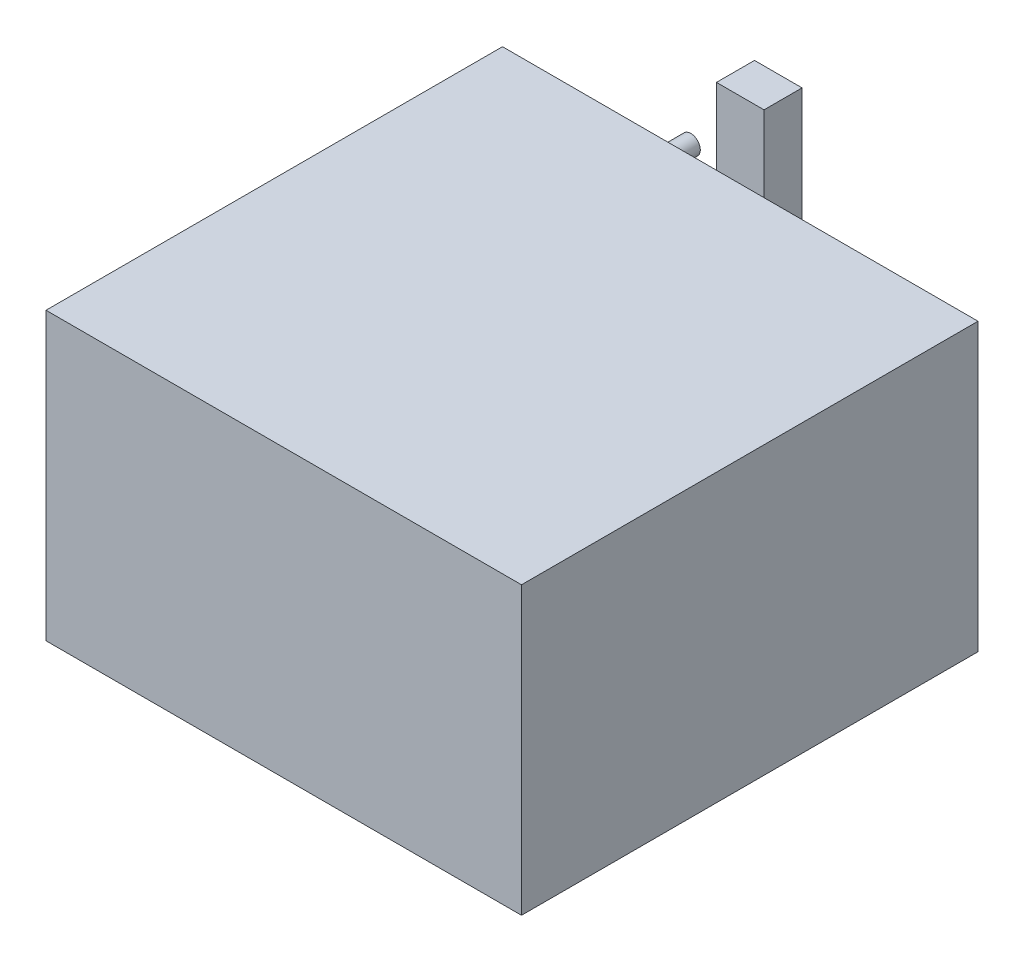
ISO-10303-21;
HEADER;
FILE_DESCRIPTION(('STEP AP214'),'2;1');
FILE_NAME('part.step','',(''),(''),'','','');
FILE_SCHEMA(('AUTOMOTIVE_DESIGN { 1 0 10303 214 1 1 1 1 }'));
ENDSEC;
DATA;
#1=APPLICATION_CONTEXT('core data for automotive mechanical design processes');
#2=APPLICATION_PROTOCOL_DEFINITION('international standard','automotive_design',2000,#1);
#3=PRODUCT_CONTEXT('',#1,'mechanical');
#4=PRODUCT('Part','Part','',(#3));
#5=PRODUCT_RELATED_PRODUCT_CATEGORY('part','',(#4));
#6=PRODUCT_DEFINITION_FORMATION('','',#4);
#7=PRODUCT_DEFINITION_CONTEXT('part definition',#1,'design');
#8=PRODUCT_DEFINITION('design','',#6,#7);
#9=PRODUCT_DEFINITION_SHAPE('','',#8);
#10=(LENGTH_UNIT() NAMED_UNIT(*) SI_UNIT(.MILLI.,.METRE.));
#11=(NAMED_UNIT(*) PLANE_ANGLE_UNIT() SI_UNIT($,.RADIAN.));
#12=(NAMED_UNIT(*) SI_UNIT($,.STERADIAN.) SOLID_ANGLE_UNIT());
#13=UNCERTAINTY_MEASURE_WITH_UNIT(LENGTH_MEASURE(1.E-05),#10,'distance_accuracy_value','');
#14=(GEOMETRIC_REPRESENTATION_CONTEXT(3) GLOBAL_UNCERTAINTY_ASSIGNED_CONTEXT((#13)) GLOBAL_UNIT_ASSIGNED_CONTEXT((#10,
#11,#12)) REPRESENTATION_CONTEXT('',''));
#15=CARTESIAN_POINT('',(0.,0.,0.));
#16=DIRECTION('',(0.,0.,1.));
#17=DIRECTION('',(1.,0.,0.));
#18=AXIS2_PLACEMENT_3D('',#15,#16,#17);
#19=CARTESIAN_POINT('',(-29.5791256800389,10.0182330252573,0.));
#20=DIRECTION('',(0.,0.,1.));
#21=DIRECTION('',(1.,0.,0.));
#22=AXIS2_PLACEMENT_3D('',#19,#20,#21);
#23=PLANE('',#22);
#24=CARTESIAN_POINT('',(-24.6791256800389,20.5682308652573,0.));
#25=DIRECTION('',(0.,0.,1.));
#26=DIRECTION('',(1.,0.,0.));
#27=AXIS2_PLACEMENT_3D('',#24,#25,#26);
#28=CIRCLE('',#27,0.499999999999999);
#29=CARTESIAN_POINT('',(-24.1791256800389,20.5682308652573,0.));
#30=VERTEX_POINT('',#29);
#31=EDGE_CURVE('E41',#30,#30,#28,.F.);
#32=ORIENTED_EDGE('',*,*,#31,.F.);
#33=EDGE_LOOP('',(#32));
#34=FACE_BOUND('',#33,.T.);
#35=CARTESIAN_POINT('',(-24.6791256800389,14.5682308652573,0.));
#36=DIRECTION('',(0.,0.,1.));
#37=DIRECTION('',(1.,0.,0.));
#38=AXIS2_PLACEMENT_3D('',#35,#36,#37);
#39=CIRCLE('',#38,0.499999999999999);
#40=CARTESIAN_POINT('',(-24.1791256800389,14.5682308652573,0.));
#41=VERTEX_POINT('',#40);
#42=EDGE_CURVE('E11',#41,#41,#39,.F.);
#43=ORIENTED_EDGE('',*,*,#42,.F.);
#44=EDGE_LOOP('',(#43));
#45=FACE_BOUND('',#44,.T.);
#46=DIRECTION('',(0.,-1.,0.));
#47=VECTOR('',#46,1.);
#48=CARTESIAN_POINT('',(-15.8291248800389,13.0182330252573,0.));
#49=LINE('',#48,#47);
#50=CARTESIAN_POINT('',(-15.8291248800389,13.0182330252573,0.));
#51=VERTEX_POINT('',#50);
#52=CARTESIAN_POINT('',(-15.8291248800389,10.0182330252573,0.));
#53=VERTEX_POINT('',#52);
#54=EDGE_CURVE('E48',#51,#53,#49,.T.);
#55=ORIENTED_EDGE('',*,*,#54,.F.);
#56=DIRECTION('',(1.,0.,0.));
#57=VECTOR('',#56,1.);
#58=CARTESIAN_POINT('',(-15.8291248800389,13.0182330252573,0.));
#59=LINE('',#58,#57);
#60=CARTESIAN_POINT('',(-18.3291248800389,13.0182330252573,0.));
#61=VERTEX_POINT('',#60);
#62=EDGE_CURVE('E153',#61,#51,#59,.T.);
#63=ORIENTED_EDGE('',*,*,#62,.F.);
#64=DIRECTION('',(0.,1.,0.));
#65=VECTOR('',#64,1.);
#66=CARTESIAN_POINT('',(-18.3291248800389,13.0182330252573,0.));
#67=LINE('',#66,#65);
#68=CARTESIAN_POINT('',(-18.3291248800389,10.0182330252573,0.));
#69=VERTEX_POINT('',#68);
#70=EDGE_CURVE('E251',#69,#61,#67,.T.);
#71=ORIENTED_EDGE('',*,*,#70,.F.);
#72=DIRECTION('',(1.,0.,0.));
#73=VECTOR('',#72,1.);
#74=CARTESIAN_POINT('',(-29.5791256800389,10.0182330252573,0.));
#75=LINE('',#74,#73);
#76=CARTESIAN_POINT('',(-29.5791256800389,10.0182330252573,0.));
#77=VERTEX_POINT('',#76);
#78=EDGE_CURVE('E214',#77,#69,#75,.T.);
#79=ORIENTED_EDGE('',*,*,#78,.F.);
#80=DIRECTION('',(0.,-1.,0.));
#81=VECTOR('',#80,1.);
#82=CARTESIAN_POINT('',(-29.5791256800389,25.0682308652573,0.));
#83=LINE('',#82,#81);
#84=CARTESIAN_POINT('',(-29.5791256800389,25.0682308652573,0.));
#85=VERTEX_POINT('',#84);
#86=EDGE_CURVE('E199',#85,#77,#83,.T.);
#87=ORIENTED_EDGE('',*,*,#86,.F.);
#88=DIRECTION('',(-1.,0.,0.));
#89=VECTOR('',#88,1.);
#90=CARTESIAN_POINT('',(-29.5791256800389,25.0682308652573,0.));
#91=LINE('',#90,#89);
#92=CARTESIAN_POINT('',(-18.3291248800389,25.0682308652573,0.));
#93=VERTEX_POINT('',#92);
#94=EDGE_CURVE('E220',#93,#85,#91,.T.);
#95=ORIENTED_EDGE('',*,*,#94,.F.);
#96=DIRECTION('',(0.,1.,0.));
#97=VECTOR('',#96,1.);
#98=CARTESIAN_POINT('',(-18.3291248800389,22.0682308652573,0.));
#99=LINE('',#98,#97);
#100=CARTESIAN_POINT('',(-18.3291248800389,22.0682308652573,0.));
#101=VERTEX_POINT('',#100);
#102=EDGE_CURVE('E56',#101,#93,#99,.T.);
#103=ORIENTED_EDGE('',*,*,#102,.F.);
#104=DIRECTION('',(-1.,0.,0.));
#105=VECTOR('',#104,1.);
#106=CARTESIAN_POINT('',(-15.8291248800389,22.0682308652573,0.));
#107=LINE('',#106,#105);
#108=CARTESIAN_POINT('',(-15.8291248800389,22.0682308652573,0.));
#109=VERTEX_POINT('',#108);
#110=EDGE_CURVE('E178',#109,#101,#107,.T.);
#111=ORIENTED_EDGE('',*,*,#110,.F.);
#112=DIRECTION('',(0.,-1.,0.));
#113=VECTOR('',#112,1.);
#114=CARTESIAN_POINT('',(-15.8291248800389,22.0682308652573,0.));
#115=LINE('',#114,#113);
#116=CARTESIAN_POINT('',(-15.8291248800389,25.0682308652573,0.));
#117=VERTEX_POINT('',#116);
#118=EDGE_CURVE('E158',#117,#109,#115,.T.);
#119=ORIENTED_EDGE('',*,*,#118,.F.);
#120=CARTESIAN_POINT('',(-4.57912488003891,25.0682308652573,0.));
#121=VERTEX_POINT('',#120);
#122=EDGE_CURVE('E204',#121,#117,#91,.T.);
#123=ORIENTED_EDGE('',*,*,#122,.F.);
#124=DIRECTION('',(0.,1.,0.));
#125=VECTOR('',#124,1.);
#126=CARTESIAN_POINT('',(-4.57912488003891,25.0682308652573,0.));
#127=LINE('',#126,#125);
#128=CARTESIAN_POINT('',(-4.57912488003891,10.0182330252573,0.));
#129=VERTEX_POINT('',#128);
#130=EDGE_CURVE('E217',#129,#121,#127,.T.);
#131=ORIENTED_EDGE('',*,*,#130,.F.);
#132=EDGE_CURVE('E213',#53,#129,#75,.T.);
#133=ORIENTED_EDGE('',*,*,#132,.F.);
#134=EDGE_LOOP('',(#55,#63,#71,#79,#87,#95,#103,#111,#119,#123,#131,#133));
#135=FACE_BOUND('',#134,.T.);
#136=ADVANCED_FACE('F33',(#34,#45,#135),#23,.F.);
#137=CARTESIAN_POINT('',(-29.5791256800389,25.0682308652573,24.));
#138=DIRECTION('',(1.,0.,0.));
#139=DIRECTION('',(0.,0.,-1.));
#140=AXIS2_PLACEMENT_3D('',#137,#138,#139);
#141=PLANE('',#140);
#142=ORIENTED_EDGE('',*,*,#86,.T.);
#143=DIRECTION('',(0.,0.,-1.));
#144=VECTOR('',#143,1.);
#145=CARTESIAN_POINT('',(-29.5791256800389,10.0182330252573,24.));
#146=LINE('',#145,#144);
#147=CARTESIAN_POINT('',(-29.5791256800389,10.0182330252573,24.));
#148=VERTEX_POINT('',#147);
#149=EDGE_CURVE('E232',#148,#77,#146,.T.);
#150=ORIENTED_EDGE('',*,*,#149,.F.);
#151=DIRECTION('',(0.,-1.,0.));
#152=VECTOR('',#151,1.);
#153=CARTESIAN_POINT('',(-29.5791256800389,25.0682308652573,24.));
#154=LINE('',#153,#152);
#155=CARTESIAN_POINT('',(-29.5791256800389,25.0682308652573,24.));
#156=VERTEX_POINT('',#155);
#157=EDGE_CURVE('E200',#156,#148,#154,.T.);
#158=ORIENTED_EDGE('',*,*,#157,.F.);
#159=DIRECTION('',(0.,0.,-1.));
#160=VECTOR('',#159,1.);
#161=CARTESIAN_POINT('',(-29.5791256800389,25.0682308652573,24.));
#162=LINE('',#161,#160);
#163=EDGE_CURVE('E210',#156,#85,#162,.T.);
#164=ORIENTED_EDGE('',*,*,#163,.T.);
#165=EDGE_LOOP('',(#142,#150,#158,#164));
#166=FACE_BOUND('',#165,.T.);
#167=ADVANCED_FACE('F35',(#166),#141,.F.);
#168=CARTESIAN_POINT('',(-29.5791256800389,10.0182330252573,24.));
#169=DIRECTION('',(0.,1.,0.));
#170=DIRECTION('',(0.,0.,1.));
#171=AXIS2_PLACEMENT_3D('',#168,#169,#170);
#172=PLANE('',#171);
#173=ORIENTED_EDGE('',*,*,#78,.T.);
#174=EDGE_CURVE('E218',#69,#53,#75,.T.);
#175=ORIENTED_EDGE('',*,*,#174,.T.);
#176=ORIENTED_EDGE('',*,*,#132,.T.);
#177=DIRECTION('',(0.,0.,-1.));
#178=VECTOR('',#177,1.);
#179=CARTESIAN_POINT('',(-4.57912488003891,10.0182330252573,24.));
#180=LINE('',#179,#178);
#181=CARTESIAN_POINT('',(-4.57912488003891,10.0182330252573,24.));
#182=VERTEX_POINT('',#181);
#183=EDGE_CURVE('E229',#182,#129,#180,.T.);
#184=ORIENTED_EDGE('',*,*,#183,.F.);
#185=DIRECTION('',(1.,0.,0.));
#186=VECTOR('',#185,1.);
#187=CARTESIAN_POINT('',(-29.5791256800389,10.0182330252573,24.));
#188=LINE('',#187,#186);
#189=EDGE_CURVE('E203',#148,#182,#188,.T.);
#190=ORIENTED_EDGE('',*,*,#189,.F.);
#191=ORIENTED_EDGE('',*,*,#149,.T.);
#192=EDGE_LOOP('',(#173,#175,#176,#184,#190,#191));
#193=FACE_BOUND('',#192,.T.);
#194=ADVANCED_FACE('F270',(#193),#172,.F.);
#195=CARTESIAN_POINT('',(-4.57912488003891,25.0682308652573,24.));
#196=DIRECTION('',(-1.,0.,0.));
#197=DIRECTION('',(0.,0.,1.));
#198=AXIS2_PLACEMENT_3D('',#195,#196,#197);
#199=PLANE('',#198);
#200=ORIENTED_EDGE('',*,*,#130,.T.);
#201=DIRECTION('',(0.,0.,-1.));
#202=VECTOR('',#201,1.);
#203=CARTESIAN_POINT('',(-4.57912488003891,25.0682308652573,24.));
#204=LINE('',#203,#202);
#205=CARTESIAN_POINT('',(-4.57912488003891,25.0682308652573,24.));
#206=VERTEX_POINT('',#205);
#207=EDGE_CURVE('E226',#206,#121,#204,.T.);
#208=ORIENTED_EDGE('',*,*,#207,.F.);
#209=DIRECTION('',(0.,1.,0.));
#210=VECTOR('',#209,1.);
#211=CARTESIAN_POINT('',(-4.57912488003891,25.0682308652573,24.));
#212=LINE('',#211,#210);
#213=EDGE_CURVE('E206',#182,#206,#212,.T.);
#214=ORIENTED_EDGE('',*,*,#213,.F.);
#215=ORIENTED_EDGE('',*,*,#183,.T.);
#216=EDGE_LOOP('',(#200,#208,#214,#215));
#217=FACE_BOUND('',#216,.T.);
#218=ADVANCED_FACE('F339',(#217),#199,.F.);
#219=CARTESIAN_POINT('',(-29.5791256800389,25.0682308652573,24.));
#220=DIRECTION('',(0.,-1.,0.));
#221=DIRECTION('',(0.,0.,-1.));
#222=AXIS2_PLACEMENT_3D('',#219,#220,#221);
#223=PLANE('',#222);
#224=ORIENTED_EDGE('',*,*,#122,.T.);
#225=EDGE_CURVE('E223',#117,#93,#91,.T.);
#226=ORIENTED_EDGE('',*,*,#225,.T.);
#227=ORIENTED_EDGE('',*,*,#94,.T.);
#228=ORIENTED_EDGE('',*,*,#163,.F.);
#229=DIRECTION('',(-1.,0.,0.));
#230=VECTOR('',#229,1.);
#231=CARTESIAN_POINT('',(-29.5791256800389,25.0682308652573,24.));
#232=LINE('',#231,#230);
#233=EDGE_CURVE('E208',#206,#156,#232,.T.);
#234=ORIENTED_EDGE('',*,*,#233,.F.);
#235=ORIENTED_EDGE('',*,*,#207,.T.);
#236=EDGE_LOOP('',(#224,#226,#227,#228,#234,#235));
#237=FACE_BOUND('',#236,.T.);
#238=ADVANCED_FACE('F280',(#237),#223,.F.);
#239=CARTESIAN_POINT('',(-29.5791256800389,10.0182330252573,24.));
#240=DIRECTION('',(0.,0.,1.));
#241=DIRECTION('',(1.,0.,0.));
#242=AXIS2_PLACEMENT_3D('',#239,#240,#241);
#243=PLANE('',#242);
#244=ORIENTED_EDGE('',*,*,#157,.T.);
#245=ORIENTED_EDGE('',*,*,#189,.T.);
#246=ORIENTED_EDGE('',*,*,#213,.T.);
#247=ORIENTED_EDGE('',*,*,#233,.T.);
#248=EDGE_LOOP('',(#244,#245,#246,#247));
#249=FACE_BOUND('',#248,.T.);
#250=ADVANCED_FACE('F332',(#249),#243,.T.);
#251=CARTESIAN_POINT('',(-24.6791256800389,20.5682308652573,-5.));
#252=DIRECTION('',(0.,0.,1.));
#253=DIRECTION('',(1.,0.,0.));
#254=AXIS2_PLACEMENT_3D('',#251,#252,#253);
#255=CYLINDRICAL_SURFACE('',#254,0.499999999999999);
#256=CARTESIAN_POINT('',(-24.6791256800389,20.5682308652573,-5.));
#257=DIRECTION('',(0.,0.,-1.));
#258=DIRECTION('',(-1.,0.,0.));
#259=AXIS2_PLACEMENT_3D('',#256,#257,#258);
#260=CIRCLE('',#259,0.499999999999999);
#261=CARTESIAN_POINT('',(-25.1791256800389,20.5682308652573,-5.));
#262=VERTEX_POINT('',#261);
#263=EDGE_CURVE('E196',#262,#262,#260,.T.);
#264=ORIENTED_EDGE('',*,*,#263,.F.);
#265=EDGE_LOOP('',(#264));
#266=FACE_BOUND('',#265,.T.);
#267=ORIENTED_EDGE('',*,*,#31,.T.);
#268=EDGE_LOOP('',(#267));
#269=FACE_BOUND('',#268,.T.);
#270=ADVANCED_FACE('F237',(#266,#269),#255,.T.);
#271=CARTESIAN_POINT('',(-24.6791256800389,20.5682308652573,-5.));
#272=DIRECTION('',(0.,0.,-1.));
#273=DIRECTION('',(-1.,0.,0.));
#274=AXIS2_PLACEMENT_3D('',#271,#272,#273);
#275=PLANE('',#274);
#276=ORIENTED_EDGE('',*,*,#263,.T.);
#277=EDGE_LOOP('',(#276));
#278=FACE_BOUND('',#277,.T.);
#279=ADVANCED_FACE('F325',(#278),#275,.T.);
#280=CARTESIAN_POINT('',(-24.6791256800389,14.5682308652573,-5.));
#281=DIRECTION('',(0.,0.,1.));
#282=DIRECTION('',(1.,0.,0.));
#283=AXIS2_PLACEMENT_3D('',#280,#281,#282);
#284=CYLINDRICAL_SURFACE('',#283,0.499999999999999);
#285=CARTESIAN_POINT('',(-24.6791256800389,14.5682308652573,-5.));
#286=DIRECTION('',(0.,0.,-1.));
#287=DIRECTION('',(-1.,0.,0.));
#288=AXIS2_PLACEMENT_3D('',#285,#286,#287);
#289=CIRCLE('',#288,0.499999999999999);
#290=CARTESIAN_POINT('',(-25.1791256800389,14.5682308652573,-5.));
#291=VERTEX_POINT('',#290);
#292=EDGE_CURVE('E193',#291,#291,#289,.T.);
#293=ORIENTED_EDGE('',*,*,#292,.F.);
#294=EDGE_LOOP('',(#293));
#295=FACE_BOUND('',#294,.T.);
#296=ORIENTED_EDGE('',*,*,#42,.T.);
#297=EDGE_LOOP('',(#296));
#298=FACE_BOUND('',#297,.T.);
#299=ADVANCED_FACE('F321',(#295,#298),#284,.T.);
#300=CARTESIAN_POINT('',(-24.6791256800389,14.5682308652573,-5.));
#301=DIRECTION('',(0.,0.,-1.));
#302=DIRECTION('',(-1.,0.,0.));
#303=AXIS2_PLACEMENT_3D('',#300,#301,#302);
#304=PLANE('',#303);
#305=ORIENTED_EDGE('',*,*,#292,.T.);
#306=EDGE_LOOP('',(#305));
#307=FACE_BOUND('',#306,.T.);
#308=ADVANCED_FACE('F318',(#307),#304,.T.);
#309=CARTESIAN_POINT('',(-15.8291248800389,29.0682308652573,0.));
#310=DIRECTION('',(0.,0.,1.));
#311=DIRECTION('',(1.,0.,0.));
#312=AXIS2_PLACEMENT_3D('',#309,#310,#311);
#313=PLANE('',#312);
#314=ORIENTED_EDGE('',*,*,#225,.F.);
#315=CARTESIAN_POINT('',(-15.8291248800389,29.0682308652573,0.));
#316=VERTEX_POINT('',#315);
#317=EDGE_CURVE('E160',#316,#117,#115,.T.);
#318=ORIENTED_EDGE('',*,*,#317,.F.);
#319=DIRECTION('',(1.,0.,0.));
#320=VECTOR('',#319,1.);
#321=CARTESIAN_POINT('',(-15.8291248800389,29.0682308652573,0.));
#322=LINE('',#321,#320);
#323=CARTESIAN_POINT('',(-18.3291248800389,29.0682308652573,0.));
#324=VERTEX_POINT('',#323);
#325=EDGE_CURVE('E170',#324,#316,#322,.T.);
#326=ORIENTED_EDGE('',*,*,#325,.F.);
#327=EDGE_CURVE('E180',#93,#324,#99,.T.);
#328=ORIENTED_EDGE('',*,*,#327,.F.);
#329=EDGE_LOOP('',(#314,#318,#326,#328));
#330=FACE_BOUND('',#329,.T.);
#331=ADVANCED_FACE('F284',(#330),#313,.T.);
#332=CARTESIAN_POINT('',(-15.8291248800389,22.0682308652573,-2.));
#333=DIRECTION('',(-1.,0.,0.));
#334=DIRECTION('',(0.,0.,1.));
#335=AXIS2_PLACEMENT_3D('',#332,#333,#334);
#336=PLANE('',#335);
#337=ORIENTED_EDGE('',*,*,#317,.T.);
#338=ORIENTED_EDGE('',*,*,#118,.T.);
#339=DIRECTION('',(0.,0.,1.));
#340=VECTOR('',#339,1.);
#341=CARTESIAN_POINT('',(-15.8291248800389,22.0682308652573,-2.));
#342=LINE('',#341,#340);
#343=CARTESIAN_POINT('',(-15.8291248800389,22.0682308652573,-2.));
#344=VERTEX_POINT('',#343);
#345=EDGE_CURVE('E190',#344,#109,#342,.T.);
#346=ORIENTED_EDGE('',*,*,#345,.F.);
#347=DIRECTION('',(0.,-1.,0.));
#348=VECTOR('',#347,1.);
#349=CARTESIAN_POINT('',(-15.8291248800389,22.0682308652573,-2.));
#350=LINE('',#349,#348);
#351=CARTESIAN_POINT('',(-15.8291248800389,29.0682308652573,-2.));
#352=VERTEX_POINT('',#351);
#353=EDGE_CURVE('E166',#352,#344,#350,.T.);
#354=ORIENTED_EDGE('',*,*,#353,.F.);
#355=DIRECTION('',(0.,0.,1.));
#356=VECTOR('',#355,1.);
#357=CARTESIAN_POINT('',(-15.8291248800389,29.0682308652573,-2.));
#358=LINE('',#357,#356);
#359=EDGE_CURVE('E175',#352,#316,#358,.T.);
#360=ORIENTED_EDGE('',*,*,#359,.T.);
#361=EDGE_LOOP('',(#337,#338,#346,#354,#360));
#362=FACE_BOUND('',#361,.T.);
#363=ADVANCED_FACE('F288',(#362),#336,.F.);
#364=CARTESIAN_POINT('',(-15.8291248800389,22.0682308652573,-2.));
#365=DIRECTION('',(0.,1.,0.));
#366=DIRECTION('',(0.,0.,1.));
#367=AXIS2_PLACEMENT_3D('',#364,#365,#366);
#368=PLANE('',#367);
#369=ORIENTED_EDGE('',*,*,#110,.T.);
#370=DIRECTION('',(0.,0.,1.));
#371=VECTOR('',#370,1.);
#372=CARTESIAN_POINT('',(-18.3291248800389,22.0682308652573,-2.));
#373=LINE('',#372,#371);
#374=CARTESIAN_POINT('',(-18.3291248800389,22.0682308652573,-2.));
#375=VERTEX_POINT('',#374);
#376=EDGE_CURVE('E188',#375,#101,#373,.T.);
#377=ORIENTED_EDGE('',*,*,#376,.F.);
#378=DIRECTION('',(-1.,0.,0.));
#379=VECTOR('',#378,1.);
#380=CARTESIAN_POINT('',(-15.8291248800389,22.0682308652573,-2.));
#381=LINE('',#380,#379);
#382=EDGE_CURVE('E169',#344,#375,#381,.T.);
#383=ORIENTED_EDGE('',*,*,#382,.F.);
#384=ORIENTED_EDGE('',*,*,#345,.T.);
#385=EDGE_LOOP('',(#369,#377,#383,#384));
#386=FACE_BOUND('',#385,.T.);
#387=ADVANCED_FACE('F294',(#386),#368,.F.);
#388=CARTESIAN_POINT('',(-18.3291248800389,22.0682308652573,-2.));
#389=DIRECTION('',(1.,0.,0.));
#390=DIRECTION('',(0.,0.,-1.));
#391=AXIS2_PLACEMENT_3D('',#388,#389,#390);
#392=PLANE('',#391);
#393=ORIENTED_EDGE('',*,*,#102,.T.);
#394=ORIENTED_EDGE('',*,*,#327,.T.);
#395=DIRECTION('',(0.,0.,1.));
#396=VECTOR('',#395,1.);
#397=CARTESIAN_POINT('',(-18.3291248800389,29.0682308652573,-2.));
#398=LINE('',#397,#396);
#399=CARTESIAN_POINT('',(-18.3291248800389,29.0682308652573,-2.));
#400=VERTEX_POINT('',#399);
#401=EDGE_CURVE('E185',#400,#324,#398,.T.);
#402=ORIENTED_EDGE('',*,*,#401,.F.);
#403=DIRECTION('',(0.,1.,0.));
#404=VECTOR('',#403,1.);
#405=CARTESIAN_POINT('',(-18.3291248800389,22.0682308652573,-2.));
#406=LINE('',#405,#404);
#407=EDGE_CURVE('E172',#375,#400,#406,.T.);
#408=ORIENTED_EDGE('',*,*,#407,.F.);
#409=ORIENTED_EDGE('',*,*,#376,.T.);
#410=EDGE_LOOP('',(#393,#394,#402,#408,#409));
#411=FACE_BOUND('',#410,.T.);
#412=ADVANCED_FACE('F296',(#411),#392,.F.);
#413=CARTESIAN_POINT('',(-15.8291248800389,29.0682308652573,-2.));
#414=DIRECTION('',(0.,-1.,0.));
#415=DIRECTION('',(0.,0.,-1.));
#416=AXIS2_PLACEMENT_3D('',#413,#414,#415);
#417=PLANE('',#416);
#418=ORIENTED_EDGE('',*,*,#325,.T.);
#419=ORIENTED_EDGE('',*,*,#359,.F.);
#420=DIRECTION('',(1.,0.,0.));
#421=VECTOR('',#420,1.);
#422=CARTESIAN_POINT('',(-15.8291248800389,29.0682308652573,-2.));
#423=LINE('',#422,#421);
#424=EDGE_CURVE('E174',#400,#352,#423,.T.);
#425=ORIENTED_EDGE('',*,*,#424,.F.);
#426=ORIENTED_EDGE('',*,*,#401,.T.);
#427=EDGE_LOOP('',(#418,#419,#425,#426));
#428=FACE_BOUND('',#427,.T.);
#429=ADVANCED_FACE('F302',(#428),#417,.F.);
#430=CARTESIAN_POINT('',(-15.8291248800389,29.0682308652573,-2.));
#431=DIRECTION('',(0.,0.,1.));
#432=DIRECTION('',(1.,0.,0.));
#433=AXIS2_PLACEMENT_3D('',#430,#431,#432);
#434=PLANE('',#433);
#435=ORIENTED_EDGE('',*,*,#353,.T.);
#436=ORIENTED_EDGE('',*,*,#382,.T.);
#437=ORIENTED_EDGE('',*,*,#407,.T.);
#438=ORIENTED_EDGE('',*,*,#424,.T.);
#439=EDGE_LOOP('',(#435,#436,#437,#438));
#440=FACE_BOUND('',#439,.T.);
#441=ADVANCED_FACE('F300',(#440),#434,.F.);
#442=CARTESIAN_POINT('',(-15.8291248800389,6.01823302525734,0.));
#443=DIRECTION('',(0.,0.,-1.));
#444=DIRECTION('',(-1.,0.,0.));
#445=AXIS2_PLACEMENT_3D('',#442,#443,#444);
#446=PLANE('',#445);
#447=CARTESIAN_POINT('',(-15.8291248800389,6.01823302525734,0.));
#448=VERTEX_POINT('',#447);
#449=EDGE_CURVE('E156',#53,#448,#49,.T.);
#450=ORIENTED_EDGE('',*,*,#449,.F.);
#451=ORIENTED_EDGE('',*,*,#174,.F.);
#452=CARTESIAN_POINT('',(-18.3291248800389,6.01823302525734,0.));
#453=VERTEX_POINT('',#452);
#454=EDGE_CURVE('E256',#453,#69,#67,.T.);
#455=ORIENTED_EDGE('',*,*,#454,.F.);
#456=DIRECTION('',(-1.,0.,0.));
#457=VECTOR('',#456,1.);
#458=CARTESIAN_POINT('',(-15.8291248800389,6.01823302525734,0.));
#459=LINE('',#458,#457);
#460=EDGE_CURVE('E249',#448,#453,#459,.T.);
#461=ORIENTED_EDGE('',*,*,#460,.F.);
#462=EDGE_LOOP('',(#450,#451,#455,#461));
#463=FACE_BOUND('',#462,.T.);
#464=ADVANCED_FACE('F309',(#463),#446,.F.);
#465=CARTESIAN_POINT('',(-15.8291248800389,13.0182330252573,-2.));
#466=DIRECTION('',(-1.,0.,0.));
#467=DIRECTION('',(0.,0.,1.));
#468=AXIS2_PLACEMENT_3D('',#465,#466,#467);
#469=PLANE('',#468);
#470=ORIENTED_EDGE('',*,*,#54,.T.);
#471=ORIENTED_EDGE('',*,*,#449,.T.);
#472=DIRECTION('',(0.,0.,1.));
#473=VECTOR('',#472,1.);
#474=CARTESIAN_POINT('',(-15.8291248800389,6.01823302525734,-2.));
#475=LINE('',#474,#473);
#476=CARTESIAN_POINT('',(-15.8291248800389,6.01823302525734,-2.));
#477=VERTEX_POINT('',#476);
#478=EDGE_CURVE('E140',#477,#448,#475,.T.);
#479=ORIENTED_EDGE('',*,*,#478,.F.);
#480=DIRECTION('',(0.,-1.,0.));
#481=VECTOR('',#480,1.);
#482=CARTESIAN_POINT('',(-15.8291248800389,13.0182330252573,-2.));
#483=LINE('',#482,#481);
#484=CARTESIAN_POINT('',(-15.8291248800389,13.0182330252573,-2.));
#485=VERTEX_POINT('',#484);
#486=EDGE_CURVE('E146',#485,#477,#483,.T.);
#487=ORIENTED_EDGE('',*,*,#486,.F.);
#488=DIRECTION('',(0.,0.,1.));
#489=VECTOR('',#488,1.);
#490=CARTESIAN_POINT('',(-15.8291248800389,13.0182330252573,-2.));
#491=LINE('',#490,#489);
#492=EDGE_CURVE('E260',#485,#51,#491,.T.);
#493=ORIENTED_EDGE('',*,*,#492,.T.);
#494=EDGE_LOOP('',(#470,#471,#479,#487,#493));
#495=FACE_BOUND('',#494,.T.);
#496=ADVANCED_FACE('F155',(#495),#469,.F.);
#497=CARTESIAN_POINT('',(-15.8291248800389,6.01823302525734,-2.));
#498=DIRECTION('',(0.,1.,0.));
#499=DIRECTION('',(-1.,0.,0.));
#500=AXIS2_PLACEMENT_3D('',#497,#498,#499);
#501=PLANE('',#500);
#502=ORIENTED_EDGE('',*,*,#460,.T.);
#503=DIRECTION('',(0.,0.,1.));
#504=VECTOR('',#503,1.);
#505=CARTESIAN_POINT('',(-18.3291248800389,6.01823302525734,-2.));
#506=LINE('',#505,#504);
#507=CARTESIAN_POINT('',(-18.3291248800389,6.01823302525734,-2.));
#508=VERTEX_POINT('',#507);
#509=EDGE_CURVE('E142',#508,#453,#506,.T.);
#510=ORIENTED_EDGE('',*,*,#509,.F.);
#511=DIRECTION('',(-1.,0.,0.));
#512=VECTOR('',#511,1.);
#513=CARTESIAN_POINT('',(-15.8291248800389,6.01823302525734,-2.));
#514=LINE('',#513,#512);
#515=EDGE_CURVE('E136',#477,#508,#514,.T.);
#516=ORIENTED_EDGE('',*,*,#515,.F.);
#517=ORIENTED_EDGE('',*,*,#478,.T.);
#518=EDGE_LOOP('',(#502,#510,#516,#517));
#519=FACE_BOUND('',#518,.T.);
#520=ADVANCED_FACE('F138',(#519),#501,.F.);
#521=CARTESIAN_POINT('',(-18.3291248800389,13.0182330252573,-2.));
#522=DIRECTION('',(1.,0.,0.));
#523=DIRECTION('',(0.,1.,0.));
#524=AXIS2_PLACEMENT_3D('',#521,#522,#523);
#525=PLANE('',#524);
#526=ORIENTED_EDGE('',*,*,#454,.T.);
#527=ORIENTED_EDGE('',*,*,#70,.T.);
#528=DIRECTION('',(0.,0.,1.));
#529=VECTOR('',#528,1.);
#530=CARTESIAN_POINT('',(-18.3291248800389,13.0182330252573,-2.));
#531=LINE('',#530,#529);
#532=CARTESIAN_POINT('',(-18.3291248800389,13.0182330252573,-2.));
#533=VERTEX_POINT('',#532);
#534=EDGE_CURVE('E162',#533,#61,#531,.T.);
#535=ORIENTED_EDGE('',*,*,#534,.F.);
#536=DIRECTION('',(0.,1.,0.));
#537=VECTOR('',#536,1.);
#538=CARTESIAN_POINT('',(-18.3291248800389,13.0182330252573,-2.));
#539=LINE('',#538,#537);
#540=EDGE_CURVE('E145',#508,#533,#539,.T.);
#541=ORIENTED_EDGE('',*,*,#540,.F.);
#542=ORIENTED_EDGE('',*,*,#509,.T.);
#543=EDGE_LOOP('',(#526,#527,#535,#541,#542));
#544=FACE_BOUND('',#543,.T.);
#545=ADVANCED_FACE('F266',(#544),#525,.F.);
#546=CARTESIAN_POINT('',(-15.8291248800389,13.0182330252573,-2.));
#547=DIRECTION('',(0.,-1.,0.));
#548=DIRECTION('',(0.,0.,-1.));
#549=AXIS2_PLACEMENT_3D('',#546,#547,#548);
#550=PLANE('',#549);
#551=ORIENTED_EDGE('',*,*,#62,.T.);
#552=ORIENTED_EDGE('',*,*,#492,.F.);
#553=DIRECTION('',(1.,0.,0.));
#554=VECTOR('',#553,1.);
#555=CARTESIAN_POINT('',(-15.8291248800389,13.0182330252573,-2.));
#556=LINE('',#555,#554);
#557=EDGE_CURVE('E151',#533,#485,#556,.T.);
#558=ORIENTED_EDGE('',*,*,#557,.F.);
#559=ORIENTED_EDGE('',*,*,#534,.T.);
#560=EDGE_LOOP('',(#551,#552,#558,#559));
#561=FACE_BOUND('',#560,.T.);
#562=ADVANCED_FACE('F264',(#561),#550,.F.);
#563=CARTESIAN_POINT('',(-15.8291248800389,6.01823302525734,-2.));
#564=DIRECTION('',(0.,0.,-1.));
#565=DIRECTION('',(-1.,0.,0.));
#566=AXIS2_PLACEMENT_3D('',#563,#564,#565);
#567=PLANE('',#566);
#568=ORIENTED_EDGE('',*,*,#486,.T.);
#569=ORIENTED_EDGE('',*,*,#515,.T.);
#570=ORIENTED_EDGE('',*,*,#540,.T.);
#571=ORIENTED_EDGE('',*,*,#557,.T.);
#572=EDGE_LOOP('',(#568,#569,#570,#571));
#573=FACE_BOUND('',#572,.T.);
#574=ADVANCED_FACE('F149',(#573),#567,.T.);
#575=CLOSED_SHELL('',(#136,#167,#194,#218,#238,#250,#270,#279,#299,#308,#331,#363,#387,#412,
#429,#441,#464,#496,#520,#545,#562,#574));
#576=MANIFOLD_SOLID_BREP('B2',#575);
#577=ADVANCED_BREP_SHAPE_REPRESENTATION('',(#18,#576),#14);
#578=SHAPE_DEFINITION_REPRESENTATION(#9,#577);
ENDSEC;
END-ISO-10303-21;
